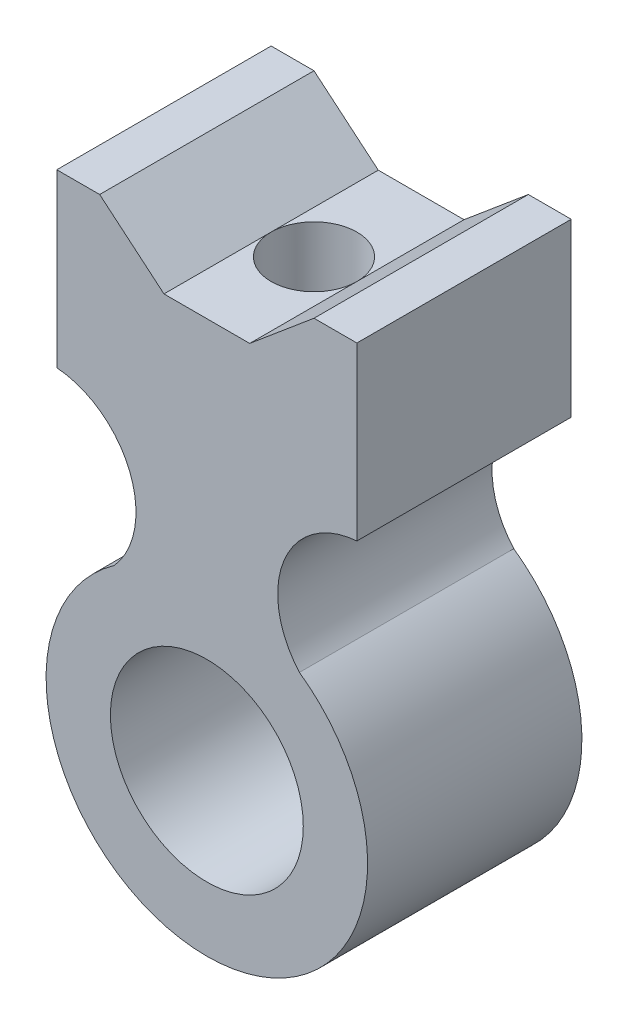
ISO-10303-21;
HEADER;
FILE_DESCRIPTION(('STEP AP214'),'2;1');
FILE_NAME('part.step','',(''),(''),'','','');
FILE_SCHEMA(('AUTOMOTIVE_DESIGN { 1 0 10303 214 1 1 1 1 }'));
ENDSEC;
DATA;
#1=APPLICATION_CONTEXT('core data for automotive mechanical design processes');
#2=APPLICATION_PROTOCOL_DEFINITION('international standard','automotive_design',2000,#1);
#3=PRODUCT_CONTEXT('',#1,'mechanical');
#4=PRODUCT('Part','Part','',(#3));
#5=PRODUCT_RELATED_PRODUCT_CATEGORY('part','',(#4));
#6=PRODUCT_DEFINITION_FORMATION('','',#4);
#7=PRODUCT_DEFINITION_CONTEXT('part definition',#1,'design');
#8=PRODUCT_DEFINITION('design','',#6,#7);
#9=PRODUCT_DEFINITION_SHAPE('','',#8);
#10=(LENGTH_UNIT() NAMED_UNIT(*) SI_UNIT(.MILLI.,.METRE.));
#11=(NAMED_UNIT(*) PLANE_ANGLE_UNIT() SI_UNIT($,.RADIAN.));
#12=(NAMED_UNIT(*) SI_UNIT($,.STERADIAN.) SOLID_ANGLE_UNIT());
#13=UNCERTAINTY_MEASURE_WITH_UNIT(LENGTH_MEASURE(1.E-05),#10,'distance_accuracy_value','');
#14=(GEOMETRIC_REPRESENTATION_CONTEXT(3) GLOBAL_UNCERTAINTY_ASSIGNED_CONTEXT((#13)) GLOBAL_UNIT_ASSIGNED_CONTEXT((#10,
#11,#12)) REPRESENTATION_CONTEXT('',''));
#15=CARTESIAN_POINT('',(0.,0.,0.));
#16=DIRECTION('',(0.,0.,1.));
#17=DIRECTION('',(1.,0.,0.));
#18=AXIS2_PLACEMENT_3D('',#15,#16,#17);
#19=CARTESIAN_POINT('',(-10.,91.316861127975,50.));
#20=DIRECTION('',(0.,-1.,0.));
#21=DIRECTION('',(0.,0.,-1.));
#22=AXIS2_PLACEMENT_3D('',#19,#20,#21);
#23=PLANE('',#22);
#24=CARTESIAN_POINT('',(0.,91.316861127975,25.));
#25=DIRECTION('',(0.,1.,0.));
#26=DIRECTION('',(0.,0.,1.));
#27=AXIS2_PLACEMENT_3D('',#24,#25,#26);
#28=CIRCLE('',#27,10.);
#29=CARTESIAN_POINT('',(10.,91.316861127975,25.));
#30=VERTEX_POINT('',#29);
#31=CARTESIAN_POINT('',(-10.,91.316861127975,25.));
#32=VERTEX_POINT('',#31);
#33=EDGE_CURVE('E52',#30,#32,#28,.T.);
#34=ORIENTED_EDGE('',*,*,#33,.F.);
#35=DIRECTION('',(0.,0.,-1.));
#36=VECTOR('',#35,1.);
#37=CARTESIAN_POINT('',(10.,91.316861127975,50.));
#38=LINE('',#37,#36);
#39=CARTESIAN_POINT('',(10.,91.316861127975,0.));
#40=VERTEX_POINT('',#39);
#41=EDGE_CURVE('E184',#30,#40,#38,.T.);
#42=ORIENTED_EDGE('',*,*,#41,.T.);
#43=DIRECTION('',(-1.,0.,0.));
#44=VECTOR('',#43,1.);
#45=CARTESIAN_POINT('',(-10.,91.316861127975,0.));
#46=LINE('',#45,#44);
#47=CARTESIAN_POINT('',(-10.,91.316861127975,0.));
#48=VERTEX_POINT('',#47);
#49=EDGE_CURVE('E171',#40,#48,#46,.T.);
#50=ORIENTED_EDGE('',*,*,#49,.T.);
#51=DIRECTION('',(0.,0.,-1.));
#52=VECTOR('',#51,1.);
#53=CARTESIAN_POINT('',(-10.,91.316861127975,50.));
#54=LINE('',#53,#52);
#55=EDGE_CURVE('E146',#32,#48,#54,.T.);
#56=ORIENTED_EDGE('',*,*,#55,.F.);
#57=EDGE_LOOP('',(#34,#42,#50,#56));
#58=FACE_BOUND('',#57,.T.);
#59=ADVANCED_FACE('F39',(#58),#23,.F.);
#60=CARTESIAN_POINT('',(-36.532421849765,43.9621499331282,50.));
#61=DIRECTION('',(0.,0.,-1.));
#62=DIRECTION('',(-1.,0.,0.));
#63=AXIS2_PLACEMENT_3D('',#60,#61,#62);
#64=PLANE('',#63);
#65=CARTESIAN_POINT('',(-36.532421849765,43.9621499331282,50.));
#66=DIRECTION('',(0.,0.,-1.));
#67=DIRECTION('',(-1.,0.,0.));
#68=AXIS2_PLACEMENT_3D('',#65,#66,#67);
#69=CIRCLE('',#68,20.);
#70=CARTESIAN_POINT('',(-35.,63.9033555956342,50.));
#71=VERTEX_POINT('',#70);
#72=CARTESIAN_POINT('',(-21.6067051808784,30.6496377013922,50.));
#73=VERTEX_POINT('',#72);
#74=EDGE_CURVE('E179',#71,#73,#69,.T.);
#75=ORIENTED_EDGE('',*,*,#74,.T.);
#76=CARTESIAN_POINT('',(0.,0.,50.));
#77=DIRECTION('',(0.,0.,1.));
#78=DIRECTION('',(1.,0.,0.));
#79=AXIS2_PLACEMENT_3D('',#76,#77,#78);
#80=CIRCLE('',#79,37.5);
#81=CARTESIAN_POINT('',(21.6067051808784,30.6496377013922,50.));
#82=VERTEX_POINT('',#81);
#83=EDGE_CURVE('E107',#73,#82,#80,.T.);
#84=ORIENTED_EDGE('',*,*,#83,.T.);
#85=CARTESIAN_POINT('',(36.532421849765,43.9621499331282,50.));
#86=DIRECTION('',(0.,0.,-1.));
#87=DIRECTION('',(1.,0.,0.));
#88=AXIS2_PLACEMENT_3D('',#85,#86,#87);
#89=CIRCLE('',#88,20.);
#90=CARTESIAN_POINT('',(35.,63.9033555956342,50.));
#91=VERTEX_POINT('',#90);
#92=EDGE_CURVE('E201',#82,#91,#89,.T.);
#93=ORIENTED_EDGE('',*,*,#92,.T.);
#94=DIRECTION('',(0.,1.,0.));
#95=VECTOR('',#94,1.);
#96=CARTESIAN_POINT('',(35.,103.903355595634,50.));
#97=LINE('',#96,#95);
#98=CARTESIAN_POINT('',(35.,103.903355595634,50.));
#99=VERTEX_POINT('',#98);
#100=EDGE_CURVE('E225',#91,#99,#97,.T.);
#101=ORIENTED_EDGE('',*,*,#100,.T.);
#102=DIRECTION('',(-1.,0.,0.));
#103=VECTOR('',#102,1.);
#104=CARTESIAN_POINT('',(25.,103.903355595634,50.));
#105=LINE('',#104,#103);
#106=CARTESIAN_POINT('',(25.,103.903355595634,50.));
#107=VERTEX_POINT('',#106);
#108=EDGE_CURVE('E219',#99,#107,#105,.T.);
#109=ORIENTED_EDGE('',*,*,#108,.T.);
#110=DIRECTION('',(-0.766044443118977,-0.642787609686541,0.));
#111=VECTOR('',#110,1.);
#112=CARTESIAN_POINT('',(25.,103.903355595634,50.));
#113=LINE('',#112,#111);
#114=CARTESIAN_POINT('',(10.,91.316861127975,50.));
#115=VERTEX_POINT('',#114);
#116=EDGE_CURVE('E221',#107,#115,#113,.T.);
#117=ORIENTED_EDGE('',*,*,#116,.T.);
#118=DIRECTION('',(-1.,0.,0.));
#119=VECTOR('',#118,1.);
#120=CARTESIAN_POINT('',(-10.,91.316861127975,50.));
#121=LINE('',#120,#119);
#122=CARTESIAN_POINT('',(-10.,91.316861127975,50.));
#123=VERTEX_POINT('',#122);
#124=EDGE_CURVE('E140',#115,#123,#121,.T.);
#125=ORIENTED_EDGE('',*,*,#124,.T.);
#126=DIRECTION('',(-0.766044443118977,0.642787609686541,0.));
#127=VECTOR('',#126,1.);
#128=CARTESIAN_POINT('',(-25.,103.903355595634,50.));
#129=LINE('',#128,#127);
#130=CARTESIAN_POINT('',(-25.,103.903355595634,50.));
#131=VERTEX_POINT('',#130);
#132=EDGE_CURVE('E129',#123,#131,#129,.T.);
#133=ORIENTED_EDGE('',*,*,#132,.T.);
#134=DIRECTION('',(-1.,0.,0.));
#135=VECTOR('',#134,1.);
#136=CARTESIAN_POINT('',(-25.,103.903355595634,50.));
#137=LINE('',#136,#135);
#138=CARTESIAN_POINT('',(-35.,103.903355595634,50.));
#139=VERTEX_POINT('',#138);
#140=EDGE_CURVE('E132',#131,#139,#137,.T.);
#141=ORIENTED_EDGE('',*,*,#140,.T.);
#142=DIRECTION('',(0.,-1.,0.));
#143=VECTOR('',#142,1.);
#144=CARTESIAN_POINT('',(-35.,103.903355595634,50.));
#145=LINE('',#144,#143);
#146=EDGE_CURVE('E65',#139,#71,#145,.T.);
#147=ORIENTED_EDGE('',*,*,#146,.T.);
#148=EDGE_LOOP('',(#75,#84,#93,#101,#109,#117,#125,#133,#141,#147));
#149=FACE_BOUND('',#148,.T.);
#150=CARTESIAN_POINT('',(0.,0.,50.));
#151=DIRECTION('',(0.,0.,1.));
#152=DIRECTION('',(1.,0.,0.));
#153=AXIS2_PLACEMENT_3D('',#150,#151,#152);
#154=CIRCLE('',#153,22.5);
#155=CARTESIAN_POINT('',(22.5,0.,50.));
#156=VERTEX_POINT('',#155);
#157=EDGE_CURVE('E165',#156,#156,#154,.T.);
#158=ORIENTED_EDGE('',*,*,#157,.F.);
#159=EDGE_LOOP('',(#158));
#160=FACE_BOUND('',#159,.T.);
#161=ADVANCED_FACE('F131',(#149,#160),#64,.F.);
#162=CARTESIAN_POINT('',(-36.532421849765,43.9621499331282,0.));
#163=DIRECTION('',(0.,0.,-1.));
#164=DIRECTION('',(-1.,0.,0.));
#165=AXIS2_PLACEMENT_3D('',#162,#163,#164);
#166=PLANE('',#165);
#167=CARTESIAN_POINT('',(-36.532421849765,43.9621499331282,0.));
#168=DIRECTION('',(0.,0.,-1.));
#169=DIRECTION('',(-1.,0.,0.));
#170=AXIS2_PLACEMENT_3D('',#167,#168,#169);
#171=CIRCLE('',#170,20.);
#172=CARTESIAN_POINT('',(-35.,63.9033555956342,0.));
#173=VERTEX_POINT('',#172);
#174=CARTESIAN_POINT('',(-21.6067051808784,30.6496377013922,0.));
#175=VERTEX_POINT('',#174);
#176=EDGE_CURVE('E156',#173,#175,#171,.T.);
#177=ORIENTED_EDGE('',*,*,#176,.F.);
#178=DIRECTION('',(0.,-1.,0.));
#179=VECTOR('',#178,1.);
#180=CARTESIAN_POINT('',(-35.,103.903355595634,0.));
#181=LINE('',#180,#179);
#182=CARTESIAN_POINT('',(-35.,103.903355595634,0.));
#183=VERTEX_POINT('',#182);
#184=EDGE_CURVE('E102',#183,#173,#181,.T.);
#185=ORIENTED_EDGE('',*,*,#184,.F.);
#186=DIRECTION('',(-1.,0.,0.));
#187=VECTOR('',#186,1.);
#188=CARTESIAN_POINT('',(-25.,103.903355595634,0.));
#189=LINE('',#188,#187);
#190=CARTESIAN_POINT('',(-25.,103.903355595634,0.));
#191=VERTEX_POINT('',#190);
#192=EDGE_CURVE('E180',#191,#183,#189,.T.);
#193=ORIENTED_EDGE('',*,*,#192,.F.);
#194=DIRECTION('',(-0.766044443118977,0.642787609686541,0.));
#195=VECTOR('',#194,1.);
#196=CARTESIAN_POINT('',(-25.,103.903355595634,0.));
#197=LINE('',#196,#195);
#198=EDGE_CURVE('E147',#48,#191,#197,.T.);
#199=ORIENTED_EDGE('',*,*,#198,.F.);
#200=ORIENTED_EDGE('',*,*,#49,.F.);
#201=DIRECTION('',(-0.766044443118977,-0.642787609686541,0.));
#202=VECTOR('',#201,1.);
#203=CARTESIAN_POINT('',(25.,103.903355595634,0.));
#204=LINE('',#203,#202);
#205=CARTESIAN_POINT('',(25.,103.903355595634,0.));
#206=VERTEX_POINT('',#205);
#207=EDGE_CURVE('E169',#206,#40,#204,.T.);
#208=ORIENTED_EDGE('',*,*,#207,.F.);
#209=DIRECTION('',(-1.,0.,0.));
#210=VECTOR('',#209,1.);
#211=CARTESIAN_POINT('',(25.,103.903355595634,0.));
#212=LINE('',#211,#210);
#213=CARTESIAN_POINT('',(35.,103.903355595634,0.));
#214=VERTEX_POINT('',#213);
#215=EDGE_CURVE('E166',#214,#206,#212,.T.);
#216=ORIENTED_EDGE('',*,*,#215,.F.);
#217=DIRECTION('',(0.,1.,0.));
#218=VECTOR('',#217,1.);
#219=CARTESIAN_POINT('',(35.,103.903355595634,0.));
#220=LINE('',#219,#218);
#221=CARTESIAN_POINT('',(35.,63.9033555956342,0.));
#222=VERTEX_POINT('',#221);
#223=EDGE_CURVE('E168',#222,#214,#220,.T.);
#224=ORIENTED_EDGE('',*,*,#223,.F.);
#225=CARTESIAN_POINT('',(36.532421849765,43.9621499331282,0.));
#226=DIRECTION('',(0.,0.,-1.));
#227=DIRECTION('',(1.,0.,0.));
#228=AXIS2_PLACEMENT_3D('',#225,#226,#227);
#229=CIRCLE('',#228,20.);
#230=CARTESIAN_POINT('',(21.6067051808784,30.6496377013922,0.));
#231=VERTEX_POINT('',#230);
#232=EDGE_CURVE('E162',#231,#222,#229,.T.);
#233=ORIENTED_EDGE('',*,*,#232,.F.);
#234=CARTESIAN_POINT('',(0.,0.,0.));
#235=DIRECTION('',(0.,0.,1.));
#236=DIRECTION('',(1.,0.,0.));
#237=AXIS2_PLACEMENT_3D('',#234,#235,#236);
#238=CIRCLE('',#237,37.5);
#239=EDGE_CURVE('E163',#175,#231,#238,.T.);
#240=ORIENTED_EDGE('',*,*,#239,.F.);
#241=EDGE_LOOP('',(#177,#185,#193,#199,#200,#208,#216,#224,#233,#240));
#242=FACE_BOUND('',#241,.T.);
#243=CARTESIAN_POINT('',(0.,0.,0.));
#244=DIRECTION('',(0.,0.,1.));
#245=DIRECTION('',(1.,0.,0.));
#246=AXIS2_PLACEMENT_3D('',#243,#244,#245);
#247=CIRCLE('',#246,22.5);
#248=CARTESIAN_POINT('',(22.5,0.,0.));
#249=VERTEX_POINT('',#248);
#250=EDGE_CURVE('E229',#249,#249,#247,.T.);
#251=ORIENTED_EDGE('',*,*,#250,.T.);
#252=EDGE_LOOP('',(#251));
#253=FACE_BOUND('',#252,.T.);
#254=ADVANCED_FACE('F210',(#242,#253),#166,.T.);
#255=CARTESIAN_POINT('',(-36.532421849765,43.9621499331282,50.));
#256=DIRECTION('',(0.,0.,-1.));
#257=DIRECTION('',(-1.,0.,0.));
#258=AXIS2_PLACEMENT_3D('',#255,#256,#257);
#259=CYLINDRICAL_SURFACE('',#258,20.);
#260=ORIENTED_EDGE('',*,*,#176,.T.);
#261=DIRECTION('',(0.,0.,-1.));
#262=VECTOR('',#261,1.);
#263=CARTESIAN_POINT('',(-21.6067051808784,30.6496377013922,50.));
#264=LINE('',#263,#262);
#265=EDGE_CURVE('E11',#73,#175,#264,.T.);
#266=ORIENTED_EDGE('',*,*,#265,.F.);
#267=ORIENTED_EDGE('',*,*,#74,.F.);
#268=DIRECTION('',(0.,0.,-1.));
#269=VECTOR('',#268,1.);
#270=CARTESIAN_POINT('',(-35.,63.9033555956342,50.));
#271=LINE('',#270,#269);
#272=EDGE_CURVE('E152',#71,#173,#271,.T.);
#273=ORIENTED_EDGE('',*,*,#272,.T.);
#274=EDGE_LOOP('',(#260,#266,#267,#273));
#275=FACE_BOUND('',#274,.T.);
#276=ADVANCED_FACE('F41',(#275),#259,.F.);
#277=CARTESIAN_POINT('',(0.,0.,50.));
#278=DIRECTION('',(0.,0.,-1.));
#279=DIRECTION('',(-1.,0.,0.));
#280=AXIS2_PLACEMENT_3D('',#277,#278,#279);
#281=CYLINDRICAL_SURFACE('',#280,37.5);
#282=ORIENTED_EDGE('',*,*,#239,.T.);
#283=DIRECTION('',(0.,0.,-1.));
#284=VECTOR('',#283,1.);
#285=CARTESIAN_POINT('',(21.6067051808784,30.6496377013922,50.));
#286=LINE('',#285,#284);
#287=EDGE_CURVE('E50',#82,#231,#286,.T.);
#288=ORIENTED_EDGE('',*,*,#287,.F.);
#289=ORIENTED_EDGE('',*,*,#83,.F.);
#290=ORIENTED_EDGE('',*,*,#265,.T.);
#291=EDGE_LOOP('',(#282,#288,#289,#290));
#292=FACE_BOUND('',#291,.T.);
#293=ADVANCED_FACE('F277',(#292),#281,.T.);
#294=CARTESIAN_POINT('',(36.532421849765,43.9621499331282,50.));
#295=DIRECTION('',(0.,0.,-1.));
#296=DIRECTION('',(-1.,0.,0.));
#297=AXIS2_PLACEMENT_3D('',#294,#295,#296);
#298=CYLINDRICAL_SURFACE('',#297,20.);
#299=ORIENTED_EDGE('',*,*,#232,.T.);
#300=DIRECTION('',(0.,0.,-1.));
#301=VECTOR('',#300,1.);
#302=CARTESIAN_POINT('',(35.,63.9033555956342,50.));
#303=LINE('',#302,#301);
#304=EDGE_CURVE('E193',#91,#222,#303,.T.);
#305=ORIENTED_EDGE('',*,*,#304,.F.);
#306=ORIENTED_EDGE('',*,*,#92,.F.);
#307=ORIENTED_EDGE('',*,*,#287,.T.);
#308=EDGE_LOOP('',(#299,#305,#306,#307));
#309=FACE_BOUND('',#308,.T.);
#310=ADVANCED_FACE('F202',(#309),#298,.F.);
#311=CARTESIAN_POINT('',(35.,103.903355595634,50.));
#312=DIRECTION('',(-1.,0.,0.));
#313=DIRECTION('',(0.,-1.,0.));
#314=AXIS2_PLACEMENT_3D('',#311,#312,#313);
#315=PLANE('',#314);
#316=ORIENTED_EDGE('',*,*,#223,.T.);
#317=DIRECTION('',(0.,0.,-1.));
#318=VECTOR('',#317,1.);
#319=CARTESIAN_POINT('',(35.,103.903355595634,50.));
#320=LINE('',#319,#318);
#321=EDGE_CURVE('E195',#99,#214,#320,.T.);
#322=ORIENTED_EDGE('',*,*,#321,.F.);
#323=ORIENTED_EDGE('',*,*,#100,.F.);
#324=ORIENTED_EDGE('',*,*,#304,.T.);
#325=EDGE_LOOP('',(#316,#322,#323,#324));
#326=FACE_BOUND('',#325,.T.);
#327=ADVANCED_FACE('F211',(#326),#315,.F.);
#328=CARTESIAN_POINT('',(25.,103.903355595634,50.));
#329=DIRECTION('',(0.,-1.,0.));
#330=DIRECTION('',(0.,0.,-1.));
#331=AXIS2_PLACEMENT_3D('',#328,#329,#330);
#332=PLANE('',#331);
#333=ORIENTED_EDGE('',*,*,#215,.T.);
#334=DIRECTION('',(0.,0.,-1.));
#335=VECTOR('',#334,1.);
#336=CARTESIAN_POINT('',(25.,103.903355595634,50.));
#337=LINE('',#336,#335);
#338=EDGE_CURVE('E188',#107,#206,#337,.T.);
#339=ORIENTED_EDGE('',*,*,#338,.F.);
#340=ORIENTED_EDGE('',*,*,#108,.F.);
#341=ORIENTED_EDGE('',*,*,#321,.T.);
#342=EDGE_LOOP('',(#333,#339,#340,#341));
#343=FACE_BOUND('',#342,.T.);
#344=ADVANCED_FACE('F220',(#343),#332,.F.);
#345=CARTESIAN_POINT('',(25.,103.903355595634,50.));
#346=DIRECTION('',(0.642787609686541,-0.766044443118977,0.));
#347=DIRECTION('',(0.766044443118976,0.642787609686541,0.));
#348=AXIS2_PLACEMENT_3D('',#345,#346,#347);
#349=PLANE('',#348);
#350=ORIENTED_EDGE('',*,*,#207,.T.);
#351=ORIENTED_EDGE('',*,*,#41,.F.);
#352=EDGE_CURVE('E186',#115,#30,#38,.T.);
#353=ORIENTED_EDGE('',*,*,#352,.F.);
#354=ORIENTED_EDGE('',*,*,#116,.F.);
#355=ORIENTED_EDGE('',*,*,#338,.T.);
#356=EDGE_LOOP('',(#350,#351,#353,#354,#355));
#357=FACE_BOUND('',#356,.T.);
#358=ADVANCED_FACE('F268',(#357),#349,.F.);
#359=EDGE_CURVE('E241',#32,#30,#28,.T.);
#360=ORIENTED_EDGE('',*,*,#359,.F.);
#361=EDGE_CURVE('E183',#123,#32,#54,.T.);
#362=ORIENTED_EDGE('',*,*,#361,.F.);
#363=ORIENTED_EDGE('',*,*,#124,.F.);
#364=ORIENTED_EDGE('',*,*,#352,.T.);
#365=EDGE_LOOP('',(#360,#362,#363,#364));
#366=FACE_BOUND('',#365,.T.);
#367=ADVANCED_FACE('F262',(#366),#23,.F.);
#368=CARTESIAN_POINT('',(-25.,103.903355595634,50.));
#369=DIRECTION('',(-0.642787609686541,-0.766044443118977,0.));
#370=DIRECTION('',(0.766044443118976,-0.642787609686541,0.));
#371=AXIS2_PLACEMENT_3D('',#368,#369,#370);
#372=PLANE('',#371);
#373=ORIENTED_EDGE('',*,*,#198,.T.);
#374=DIRECTION('',(0.,0.,-1.));
#375=VECTOR('',#374,1.);
#376=CARTESIAN_POINT('',(-25.,103.903355595634,50.));
#377=LINE('',#376,#375);
#378=EDGE_CURVE('E142',#131,#191,#377,.T.);
#379=ORIENTED_EDGE('',*,*,#378,.F.);
#380=ORIENTED_EDGE('',*,*,#132,.F.);
#381=ORIENTED_EDGE('',*,*,#361,.T.);
#382=ORIENTED_EDGE('',*,*,#55,.T.);
#383=EDGE_LOOP('',(#373,#379,#380,#381,#382));
#384=FACE_BOUND('',#383,.T.);
#385=ADVANCED_FACE('F143',(#384),#372,.F.);
#386=CARTESIAN_POINT('',(-25.,103.903355595634,50.));
#387=DIRECTION('',(0.,-1.,0.));
#388=DIRECTION('',(0.,0.,-1.));
#389=AXIS2_PLACEMENT_3D('',#386,#387,#388);
#390=PLANE('',#389);
#391=ORIENTED_EDGE('',*,*,#192,.T.);
#392=DIRECTION('',(0.,0.,-1.));
#393=VECTOR('',#392,1.);
#394=CARTESIAN_POINT('',(-35.,103.903355595634,50.));
#395=LINE('',#394,#393);
#396=EDGE_CURVE('E148',#139,#183,#395,.T.);
#397=ORIENTED_EDGE('',*,*,#396,.F.);
#398=ORIENTED_EDGE('',*,*,#140,.F.);
#399=ORIENTED_EDGE('',*,*,#378,.T.);
#400=EDGE_LOOP('',(#391,#397,#398,#399));
#401=FACE_BOUND('',#400,.T.);
#402=ADVANCED_FACE('F155',(#401),#390,.F.);
#403=CARTESIAN_POINT('',(-35.,103.903355595634,50.));
#404=DIRECTION('',(1.,0.,0.));
#405=DIRECTION('',(0.,1.,0.));
#406=AXIS2_PLACEMENT_3D('',#403,#404,#405);
#407=PLANE('',#406);
#408=ORIENTED_EDGE('',*,*,#184,.T.);
#409=ORIENTED_EDGE('',*,*,#272,.F.);
#410=ORIENTED_EDGE('',*,*,#146,.F.);
#411=ORIENTED_EDGE('',*,*,#396,.T.);
#412=EDGE_LOOP('',(#408,#409,#410,#411));
#413=FACE_BOUND('',#412,.T.);
#414=ADVANCED_FACE('F251',(#413),#407,.F.);
#415=CARTESIAN_POINT('',(0.,0.,50.));
#416=DIRECTION('',(0.,0.,-1.));
#417=DIRECTION('',(-1.,0.,0.));
#418=AXIS2_PLACEMENT_3D('',#415,#416,#417);
#419=CYLINDRICAL_SURFACE('',#418,22.5);
#420=CARTESIAN_POINT('',(0.,22.5,35.));
#421=CARTESIAN_POINT('',(0.26635867450663,22.4999983412741,34.9999980148914));
#422=CARTESIAN_POINT('',(0.532785210886052,22.4952577550859,34.9893440742977));
#423=CARTESIAN_POINT('',(1.06372052827527,22.4764129887687,34.9468333296432));
#424=CARTESIAN_POINT('',(1.3282281265239,22.4623034599646,34.9149644140497));
#425=CARTESIAN_POINT('',(1.8537840988072,22.4250533191297,34.830283076839));
#426=CARTESIAN_POINT('',(2.11482429416229,22.4018943007243,34.777427966414));
#427=CARTESIAN_POINT('',(2.6310373656518,22.3471481148333,34.6513341430911));
#428=CARTESIAN_POINT('',(2.88620982358468,22.3155603486293,34.578093982168));
#429=CARTESIAN_POINT('',(3.38804988474802,22.2448892220842,34.4122632036919));
#430=CARTESIAN_POINT('',(3.63474528214795,22.2058338172876,34.3197446434995));
#431=CARTESIAN_POINT('',(4.11911290035002,22.1211070120447,34.1160271951462));
#432=CARTESIAN_POINT('',(4.35678483992095,22.0754354056065,34.0048277253484));
#433=CARTESIAN_POINT('',(4.82167159326359,21.9785761888309,33.7646949901757));
#434=CARTESIAN_POINT('',(5.04889152249533,21.9273913187015,33.6357705257697));
#435=CARTESIAN_POINT('',(5.4918656108736,21.8206650853106,33.3610656241757));
#436=CARTESIAN_POINT('',(5.7076155151956,21.765122124065,33.2152789947493));
#437=CARTESIAN_POINT('',(6.35714242369688,21.5880568498737,32.7385003050336));
#438=CARTESIAN_POINT('',(6.76979822740148,21.4611409325697,32.3801279206898));
#439=CARTESIAN_POINT('',(7.53139326958646,21.2058946147112,31.6011424784357));
#440=CARTESIAN_POINT('',(7.88029452728653,21.0775634189794,31.180492588007));
#441=CARTESIAN_POINT('',(8.35877756226239,20.8904888985783,30.4967621926589));
#442=CARTESIAN_POINT('',(8.51431075280241,20.8274141488895,30.2526691304428));
#443=CARTESIAN_POINT('',(8.80409930019552,20.706580039709,29.7509638748548));
#444=CARTESIAN_POINT('',(8.93836354110986,20.6488184651489,29.4933573862268));
#445=CARTESIAN_POINT('',(9.18442154561301,20.5405571154436,28.9662324796289));
#446=CARTESIAN_POINT('',(9.29622029918278,20.4900557283934,28.696716723178));
#447=CARTESIAN_POINT('',(9.49622142398353,20.3981349149272,28.1475607468407));
#448=CARTESIAN_POINT('',(9.58442582587337,20.3567147069907,27.8679214005993));
#449=CARTESIAN_POINT('',(9.73218489954871,20.2864713022003,27.3155897322206));
#450=CARTESIAN_POINT('',(9.79300174905989,20.2571004246296,27.0433048132203));
#451=CARTESIAN_POINT('',(9.89175779481313,20.2090612627247,26.4936771914048));
#452=CARTESIAN_POINT('',(9.92969778262004,20.1903926080827,26.2163346639306));
#453=CARTESIAN_POINT('',(9.98217951008384,20.1644973394177,25.6590700135846));
#454=CARTESIAN_POINT('',(9.99673464930624,20.1572641728748,25.3791494604793));
#455=CARTESIAN_POINT('',(10.0022834901155,20.1545116933501,24.8190258678714));
#456=CARTESIAN_POINT('',(9.99327870550299,20.1589916277639,24.5388228476745));
#457=CARTESIAN_POINT('',(9.95370553775352,20.178556996954,24.0056884608056));
#458=CARTESIAN_POINT('',(9.92514683895552,20.1926536074241,23.7525683228406));
#459=CARTESIAN_POINT('',(9.84893398121707,20.2299357176033,23.2498113339681));
#460=CARTESIAN_POINT('',(9.80127332950511,20.2531243076265,23.0001756973318));
#461=CARTESIAN_POINT('',(9.68736967775726,20.3078519348151,22.5061850497813));
#462=CARTESIAN_POINT('',(9.62113064392871,20.3393891895847,22.2618289237493));
#463=CARTESIAN_POINT('',(9.47067093458348,20.4098821228145,21.7797222427858));
#464=CARTESIAN_POINT('',(9.38644317253834,20.4488407242047,21.541974332949));
#465=CARTESIAN_POINT('',(9.19869507343532,20.5339927684761,21.0693405965971));
#466=CARTESIAN_POINT('',(9.09479139530678,20.5803264052518,20.8346325245278));
#467=CARTESIAN_POINT('',(8.86972683399476,20.6783222006865,20.3746857722852));
#468=CARTESIAN_POINT('',(8.74855854398004,20.7299866437201,20.1494512104153));
#469=CARTESIAN_POINT('',(8.48979808494964,20.8372968943357,19.7095892326695));
#470=CARTESIAN_POINT('',(8.35220400067697,20.8929431658974,19.4949630578713));
#471=CARTESIAN_POINT('',(8.06140567885882,21.0068589492687,19.0772892511393));
#472=CARTESIAN_POINT('',(7.90820044490402,21.0651286283891,18.8742423595654));
#473=CARTESIAN_POINT('',(7.57127612315423,21.1887005762833,18.4613816264994));
#474=CARTESIAN_POINT('',(7.38603823151229,21.254133812688,18.2528441557939));
#475=CARTESIAN_POINT('',(6.9988280858469,21.3847641683632,17.8519904606618));
#476=CARTESIAN_POINT('',(6.79686094083624,21.4499613534205,17.6596693198084));
#477=CARTESIAN_POINT('',(6.37707504510994,21.5784874997096,17.292161001853));
#478=CARTESIAN_POINT('',(6.15924551934531,21.6418151491746,17.1169856645673));
#479=CARTESIAN_POINT('',(5.70911306089899,21.7648901464863,16.7851242679613));
#480=CARTESIAN_POINT('',(5.47681597710943,21.8246389222671,16.6284308100468));
#481=CARTESIAN_POINT('',(4.99181150591134,21.9407342792391,16.3302104354215));
#482=CARTESIAN_POINT('',(4.73870176201837,21.9969259705791,16.1892761980806));
#483=CARTESIAN_POINT('',(4.22000703014156,22.1022977955686,15.9294057079703));
#484=CARTESIAN_POINT('',(3.95442164870327,22.1514777078841,15.8104701495763));
#485=CARTESIAN_POINT('',(3.41277136658874,22.2413648148402,15.595862457202));
#486=CARTESIAN_POINT('',(3.13671186960291,22.2820763099849,15.5001785112154));
#487=CARTESIAN_POINT('',(2.57611847726869,22.3538236970007,15.333090692128));
#488=CARTESIAN_POINT('',(2.29158532996721,22.3848604401935,15.2616846826605));
#489=CARTESIAN_POINT('',(1.7365537918601,22.4344936419773,15.1481515776719));
#490=CARTESIAN_POINT('',(1.46646625264617,22.4538085491569,15.1043255414553));
#491=CARTESIAN_POINT('',(0.923093824753187,22.4827022481691,15.0389375000803));
#492=CARTESIAN_POINT('',(0.649809085093726,22.492281491961,15.0173744614051));
#493=CARTESIAN_POINT('',(0.10230519989346,22.5014327813663,14.9967724392851));
#494=CARTESIAN_POINT('',(-0.171913650464062,22.5010077394445,14.9977269005076));
#495=CARTESIAN_POINT('',(-0.719144891104905,22.4901693364661,15.0221325925831));
#496=CARTESIAN_POINT('',(-0.992157315225747,22.4797562573607,15.0455831883952));
#497=CARTESIAN_POINT('',(-1.5189915807864,22.4501266532091,15.1126834462688));
#498=CARTESIAN_POINT('',(-1.77300551778789,22.4314577903456,15.155078021128));
#499=CARTESIAN_POINT('',(-2.27629807370031,22.3859845778249,15.2591327319647));
#500=CARTESIAN_POINT('',(-2.52557692111296,22.3591806218089,15.3207919357687));
#501=CARTESIAN_POINT('',(-3.01777988637281,22.2980830127615,15.4627777164779));
#502=CARTESIAN_POINT('',(-3.26070466806967,22.2637901456724,15.5431023345517));
#503=CARTESIAN_POINT('',(-3.73886931839741,22.1884984795923,15.721744502966));
#504=CARTESIAN_POINT('',(-3.97410620011855,22.1474971105103,15.8200689509358));
#505=CARTESIAN_POINT('',(-4.44261938773792,22.0583710838479,16.0371971921661));
#506=CARTESIAN_POINT('',(-4.6756120607899,22.010065898814,16.156538555399));
#507=CARTESIAN_POINT('',(-5.13078390971223,21.908433598371,16.4126095410839));
#508=CARTESIAN_POINT('',(-5.3529593619274,21.8551047719357,16.5493450935029));
#509=CARTESIAN_POINT('',(-5.78535529571013,21.744642321343,16.839274873739));
#510=CARTESIAN_POINT('',(-5.99557349755945,21.6875079761196,16.9924722241134));
#511=CARTESIAN_POINT('',(-6.40302886015367,21.5707242991031,17.3143872496539));
#512=CARTESIAN_POINT('',(-6.60026539332612,21.5110748459504,17.4831056742108));
#513=CARTESIAN_POINT('',(-6.99623977160872,21.38572348661,17.8493967299912));
#514=CARTESIAN_POINT('',(-7.19381006998432,21.3199221098287,18.0481993400305));
#515=CARTESIAN_POINT('',(-7.57157516822002,21.1887052352925,18.4616783932445));
#516=CARTESIAN_POINT('',(-7.75177501761081,21.1232896306177,18.6763501910435));
#517=CARTESIAN_POINT('',(-8.09388924179569,20.9945797859484,19.1205795317091));
#518=CARTESIAN_POINT('',(-8.25579488629139,20.9312865688396,19.3501441000833));
#519=CARTESIAN_POINT('',(-8.56016436228012,20.8086644919195,19.8228750395312));
#520=CARTESIAN_POINT('',(-8.70262579589177,20.7493361215172,20.0660430829965));
#521=CARTESIAN_POINT('',(-8.97014113507601,20.6351213631841,20.570551892332));
#522=CARTESIAN_POINT('',(-9.09469990199382,20.5803743435446,20.8321874680576));
#523=CARTESIAN_POINT('',(-9.32103921932126,20.4788579023647,21.3664951660422));
#524=CARTESIAN_POINT('',(-9.42283046316672,20.4320847381341,21.6391620357666));
#525=CARTESIAN_POINT('',(-9.6025356438913,20.3482468504859,22.1935497004592));
#526=CARTESIAN_POINT('',(-9.68046316559654,20.3111766052706,22.4752652430133));
#527=CARTESIAN_POINT('',(-9.81152406599923,20.2481926425272,23.0456239334573));
#528=CARTESIAN_POINT('',(-9.86466024597034,20.222277664546,23.3342662947809));
#529=CARTESIAN_POINT('',(-9.94197643772676,20.1843698111919,23.891249912294));
#530=CARTESIAN_POINT('',(-9.96822966613534,20.1713827745655,24.1592372962057));
#531=CARTESIAN_POINT('',(-9.99902478688881,20.1561357409042,24.6967567554719));
#532=CARTESIAN_POINT('',(-10.0035679599608,20.1538751110936,24.9662887387675));
#533=CARTESIAN_POINT('',(-9.99088649900075,20.1601645139545,25.5046580617197));
#534=CARTESIAN_POINT('',(-9.9736659420863,20.1687125217854,25.7734955220321));
#535=CARTESIAN_POINT('',(-9.91768517459674,20.196298945699,26.3083668060109));
#536=CARTESIAN_POINT('',(-9.87892530112928,20.2153371976009,26.5744006734894));
#537=CARTESIAN_POINT('',(-9.78332716332783,20.2617654840576,27.0856661819865));
#538=CARTESIAN_POINT('',(-9.72772411668519,20.2885807362236,27.3311828051239));
#539=CARTESIAN_POINT('',(-9.59846160365255,20.3500529208607,27.8164909913803));
#540=CARTESIAN_POINT('',(-9.52479598029974,20.3847125269139,28.056280571681));
#541=CARTESIAN_POINT('',(-9.36008167510315,20.4608673563323,28.5286564779378));
#542=CARTESIAN_POINT('',(-9.26903546216244,20.5023616087251,28.7612438215205));
#543=CARTESIAN_POINT('',(-9.07027346894596,20.5910654560539,29.2180887307484));
#544=CARTESIAN_POINT('',(-8.96255159020797,20.6382771405329,29.4423432116251));
#545=CARTESIAN_POINT('',(-8.60073036887333,20.7930068459953,30.1289173977756));
#546=CARTESIAN_POINT('',(-8.31840632323343,20.9085624707511,30.5749207966406));
#547=CARTESIAN_POINT('',(-7.68859265364666,21.1482560424409,31.4157415681234));
#548=CARTESIAN_POINT('',(-7.34107581132981,21.2723975603181,31.8105374444338));
#549=CARTESIAN_POINT('',(-6.76002102416189,21.4615623012626,32.3745266720704));
#550=CARTESIAN_POINT('',(-6.54670794344012,21.5277465050087,32.5645435705713));
#551=CARTESIAN_POINT('',(-6.10413045502065,21.6573931597522,32.9259789466492));
#552=CARTESIAN_POINT('',(-5.87487111875031,21.7208564657984,33.097403293274));
#553=CARTESIAN_POINT('',(-5.40151273688932,21.8433853752714,33.4205616904781));
#554=CARTESIAN_POINT('',(-5.15740311817856,21.9024477771704,33.5722814650408));
#555=CARTESIAN_POINT('',(-4.65596026548334,22.0144954122653,33.8546488183805));
#556=CARTESIAN_POINT('',(-4.39862804632114,22.0674811108367,33.9852980111293));
#557=CARTESIAN_POINT('',(-3.87534389039682,22.165327949851,34.2229802926665));
#558=CARTESIAN_POINT('',(-3.60952001311623,22.2102730712236,34.3302603970174));
#559=CARTESIAN_POINT('',(-3.06846283264102,22.2914633569308,34.5219157404108));
#560=CARTESIAN_POINT('',(-2.79323056105034,22.3277094716136,34.6062934816203));
#561=CARTESIAN_POINT('',(-2.23619222618309,22.3903507155281,34.7510024794408));
#562=CARTESIAN_POINT('',(-1.95440508544984,22.4167711762197,34.8113955983707));
#563=CARTESIAN_POINT('',(-1.3860353704284,22.4590737483085,34.9076677076366));
#564=CARTESIAN_POINT('',(-1.09945626989596,22.4749631808528,34.9435637288167));
#565=CARTESIAN_POINT('',(-0.676807281398996,22.4902249032581,34.9779903075275));
#566=CARTESIAN_POINT('',(-0.541611708159798,22.4938876174314,34.9862406944134));
#567=CARTESIAN_POINT('',(-0.270949944583033,22.4987756018156,34.9972460774307));
#568=CARTESIAN_POINT('',(-0.135483751120319,22.5000008437135,35.0000010097285));
#569=CARTESIAN_POINT('',(0.,22.5,35.));
#570=B_SPLINE_CURVE_WITH_KNOTS('',3,(#420,#421,#422,#423,#424,#425,#426,#427,#428,#429,#430,
#431,#432,#433,#434,#435,#436,#437,#438,#439,#440,#441,#442,#443,#444,#445,#446,#447,#448,#449,
#450,#451,#452,#453,#454,#455,#456,#457,#458,#459,#460,#461,#462,#463,#464,#465,#466,#467,#468,
#469,#470,#471,#472,#473,#474,#475,#476,#477,#478,#479,#480,#481,#482,#483,#484,#485,#486,#487,
#488,#489,#490,#491,#492,#493,#494,#495,#496,#497,#498,#499,#500,#501,#502,#503,#504,#505,#506,
#507,#508,#509,#510,#511,#512,#513,#514,#515,#516,#517,#518,#519,#520,#521,#522,#523,#524,#525,
#526,#527,#528,#529,#530,#531,#532,#533,#534,#535,#536,#537,#538,#539,#540,#541,#542,#543,#544,
#545,#546,#547,#548,#549,#550,#551,#552,#553,#554,#555,#556,#557,#558,#559,#560,#561,#562,#563,
#564,#565,#566,#567,#568,#569),.UNSPECIFIED.,.T.,.F.,(4,2,2,2,2,2,2,2,2,2,2,2,2,2,2,2,2,2,2,2,2,
2,2,2,2,2,2,2,2,2,2,2,2,2,2,2,2,2,2,2,2,2,2,2,2,2,2,2,2,2,2,2,2,2,2,2,2,2,2,2,2,2,2,2,2,2,2,2,2,
2,2,2,2,2,4),(0.,0.798939988736114,1.59833648028422,2.39936745399693,3.20045534241788,
3.99860103417524,4.79677158109496,5.59454723518232,6.39261678960635,8.06823192686052,
9.74484205435458,10.6325756831291,11.5199375213358,12.4071020424309,13.2941901847141,
14.1346521822908,14.9750850972784,15.8150362705344,16.6549334755631,17.4193840619599,
18.1840947064805,18.9486422207896,19.713491480414,20.495151264384,21.2771474099687,
22.0592348259744,22.8413721914028,23.6999091725123,24.5581849215304,25.4170492213531,
26.2755685285796,27.1597265650927,28.0439125047716,28.9276483274309,29.8113063645341,
30.6331401318182,31.4549357453345,32.2764921192689,33.0980253022627,33.8717427906967,
34.6454228464181,35.4190217453608,36.1929177143792,36.9906540065471,37.7886629927483,
38.5868236174462,39.3850227993026,40.2477471216788,41.1102198918945,41.9731025254806,
42.836091474737,43.7196246852545,44.6027420429537,45.4853557326304,46.3678696680602,
47.1755535918615,47.9831898679063,48.790674867494,49.5981472296473,50.3567815506315,
51.1156748265053,51.8744603821191,52.6335240918382,54.2474381734602,55.8620275792542,
56.7408578711326,57.6194099332248,58.4985949995077,59.377712689651,60.2470308231937,
61.1162539422829,61.9832203267678,62.8495833641855,63.2559607029152,63.6623427619733),.UNSPECIFIED.);
#571=CARTESIAN_POINT('',(0.,22.5,35.));
#572=VERTEX_POINT('',#571);
#573=EDGE_CURVE('E234',#572,#572,#570,.T.);
#574=ORIENTED_EDGE('',*,*,#573,.T.);
#575=EDGE_LOOP('',(#574));
#576=FACE_BOUND('',#575,.T.);
#577=ORIENTED_EDGE('',*,*,#157,.T.);
#578=EDGE_LOOP('',(#577));
#579=FACE_BOUND('',#578,.T.);
#580=ORIENTED_EDGE('',*,*,#250,.F.);
#581=EDGE_LOOP('',(#580));
#582=FACE_BOUND('',#581,.T.);
#583=ADVANCED_FACE('F249',(#576,#579,#582),#419,.F.);
#584=CARTESIAN_POINT('',(0.,-37.501,25.));
#585=DIRECTION('',(0.,1.,0.));
#586=DIRECTION('',(0.,0.,1.));
#587=AXIS2_PLACEMENT_3D('',#584,#585,#586);
#588=CYLINDRICAL_SURFACE('',#587,10.);
#589=ORIENTED_EDGE('',*,*,#573,.F.);
#590=EDGE_LOOP('',(#589));
#591=FACE_BOUND('',#590,.T.);
#592=ORIENTED_EDGE('',*,*,#33,.T.);
#593=ORIENTED_EDGE('',*,*,#359,.T.);
#594=EDGE_LOOP('',(#592,#593));
#595=FACE_BOUND('',#594,.T.);
#596=ADVANCED_FACE('F242',(#591,#595),#588,.F.);
#597=CLOSED_SHELL('',(#59,#161,#254,#276,#293,#310,#327,#344,#358,#367,#385,#402,#414,#583,#596));
#598=MANIFOLD_SOLID_BREP('B2',#597);
#599=ADVANCED_BREP_SHAPE_REPRESENTATION('',(#18,#598),#14);
#600=SHAPE_DEFINITION_REPRESENTATION(#9,#599);
ENDSEC;
END-ISO-10303-21;
